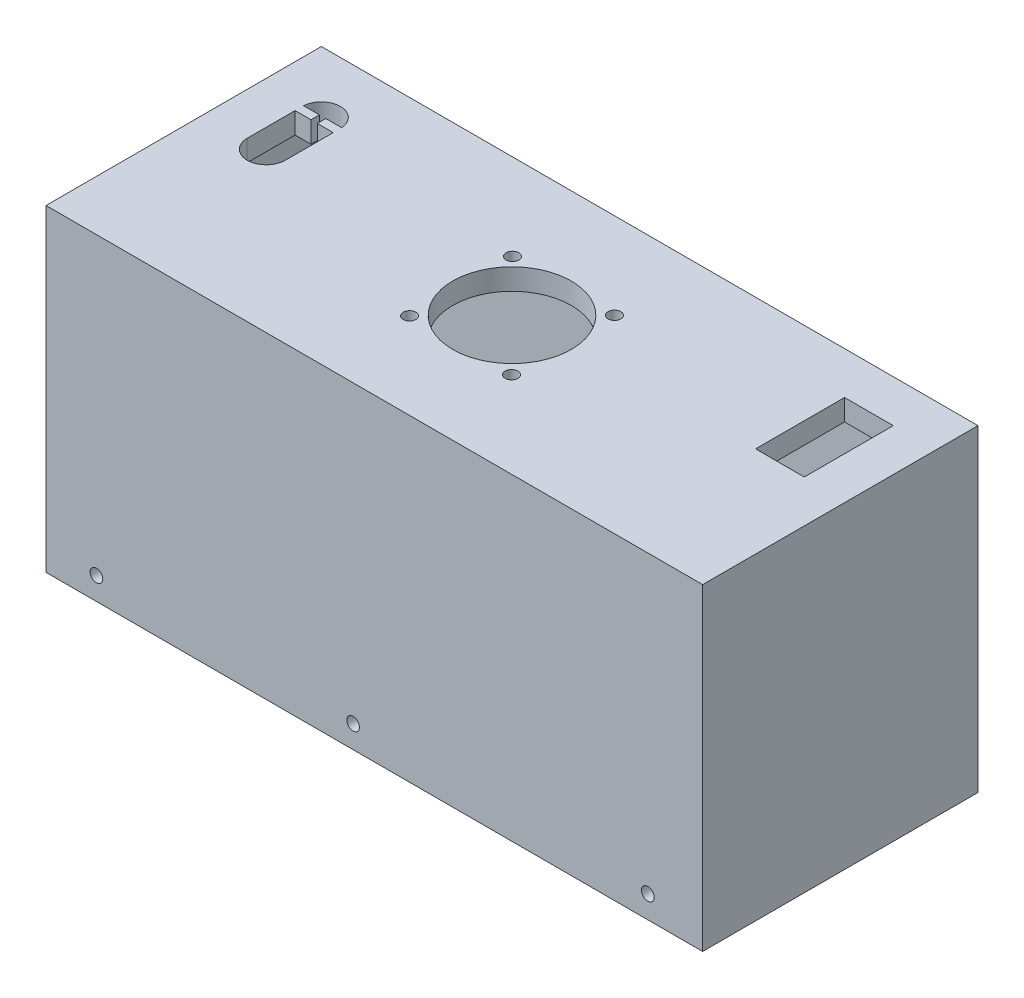
ISO-10303-21;
HEADER;
FILE_DESCRIPTION(('STEP AP214'),'2;1');
FILE_NAME('part.step','',(''),(''),'','','');
FILE_SCHEMA(('AUTOMOTIVE_DESIGN { 1 0 10303 214 1 1 1 1 }'));
ENDSEC;
DATA;
#1=APPLICATION_CONTEXT('core data for automotive mechanical design processes');
#2=APPLICATION_PROTOCOL_DEFINITION('international standard','automotive_design',2000,#1);
#3=PRODUCT_CONTEXT('',#1,'mechanical');
#4=PRODUCT('Part','Part','',(#3));
#5=PRODUCT_RELATED_PRODUCT_CATEGORY('part','',(#4));
#6=PRODUCT_DEFINITION_FORMATION('','',#4);
#7=PRODUCT_DEFINITION_CONTEXT('part definition',#1,'design');
#8=PRODUCT_DEFINITION('design','',#6,#7);
#9=PRODUCT_DEFINITION_SHAPE('','',#8);
#10=(LENGTH_UNIT() NAMED_UNIT(*) SI_UNIT(.MILLI.,.METRE.));
#11=(NAMED_UNIT(*) PLANE_ANGLE_UNIT() SI_UNIT($,.RADIAN.));
#12=(NAMED_UNIT(*) SI_UNIT($,.STERADIAN.) SOLID_ANGLE_UNIT());
#13=UNCERTAINTY_MEASURE_WITH_UNIT(LENGTH_MEASURE(1.E-05),#10,'distance_accuracy_value','');
#14=(GEOMETRIC_REPRESENTATION_CONTEXT(3) GLOBAL_UNCERTAINTY_ASSIGNED_CONTEXT((#13)) GLOBAL_UNIT_ASSIGNED_CONTEXT((#10,
#11,#12)) REPRESENTATION_CONTEXT('',''));
#15=CARTESIAN_POINT('',(0.,0.,0.));
#16=DIRECTION('',(0.,0.,1.));
#17=DIRECTION('',(1.,0.,0.));
#18=AXIS2_PLACEMENT_3D('',#15,#16,#17);
#19=CARTESIAN_POINT('',(0.,75.,0.));
#20=DIRECTION('',(0.,1.,0.));
#21=DIRECTION('',(0.,0.,1.));
#22=AXIS2_PLACEMENT_3D('',#19,#20,#21);
#23=PLANE('',#22);
#24=CARTESIAN_POINT('',(-126.409090909091,75.,7.90909090909085));
#25=DIRECTION('',(0.,1.,0.));
#26=DIRECTION('',(0.,0.,1.));
#27=AXIS2_PLACEMENT_3D('',#24,#25,#26);
#28=CIRCLE('',#27,4.49999999999998);
#29=CARTESIAN_POINT('',(-121.919102044962,75.,7.60909090909087));
#30=VERTEX_POINT('',#29);
#31=CARTESIAN_POINT('',(-130.89907977322,75.,7.60909090909087));
#32=VERTEX_POINT('',#31);
#33=EDGE_CURVE('E290',#30,#32,#28,.T.);
#34=ORIENTED_EDGE('',*,*,#33,.F.);
#35=DIRECTION('',(-1.,0.,0.));
#36=VECTOR('',#35,1.);
#37=CARTESIAN_POINT('',(-121.909090909091,75.,7.60909090909087));
#38=LINE('',#37,#36);
#39=CARTESIAN_POINT('',(-125.659090909091,75.,7.60909090909088));
#40=VERTEX_POINT('',#39);
#41=EDGE_CURVE('E472',#30,#40,#38,.T.);
#42=ORIENTED_EDGE('',*,*,#41,.T.);
#43=DIRECTION('',(0.,0.,1.));
#44=VECTOR('',#43,1.);
#45=CARTESIAN_POINT('',(-125.659090909091,75.,7.60909090909088));
#46=LINE('',#45,#44);
#47=CARTESIAN_POINT('',(-125.659090909091,75.,9.60909090909087));
#48=VERTEX_POINT('',#47);
#49=EDGE_CURVE('E226',#40,#48,#46,.T.);
#50=ORIENTED_EDGE('',*,*,#49,.T.);
#51=DIRECTION('',(1.,0.,0.));
#52=VECTOR('',#51,1.);
#53=CARTESIAN_POINT('',(-121.909090909091,75.,9.60909090909087));
#54=LINE('',#53,#52);
#55=CARTESIAN_POINT('',(-121.909090909091,75.,9.60909090909087));
#56=VERTEX_POINT('',#55);
#57=EDGE_CURVE('E211',#48,#56,#54,.T.);
#58=ORIENTED_EDGE('',*,*,#57,.T.);
#59=DIRECTION('',(0.,0.,1.));
#60=VECTOR('',#59,1.);
#61=CARTESIAN_POINT('',(-121.909090909091,75.,7.90909090909085));
#62=LINE('',#61,#60);
#63=CARTESIAN_POINT('',(-121.909090909091,75.,20.9090909090909));
#64=VERTEX_POINT('',#63);
#65=EDGE_CURVE('E294',#56,#64,#62,.T.);
#66=ORIENTED_EDGE('',*,*,#65,.T.);
#67=CARTESIAN_POINT('',(-126.409090909091,75.,20.9090909090909));
#68=DIRECTION('',(0.,1.,0.));
#69=DIRECTION('',(0.,0.,1.));
#70=AXIS2_PLACEMENT_3D('',#67,#68,#69);
#71=CIRCLE('',#70,4.49999999999998);
#72=CARTESIAN_POINT('',(-130.909090909091,75.,20.9090909090909));
#73=VERTEX_POINT('',#72);
#74=EDGE_CURVE('E296',#73,#64,#71,.T.);
#75=ORIENTED_EDGE('',*,*,#74,.F.);
#76=DIRECTION('',(0.,0.,1.));
#77=VECTOR('',#76,1.);
#78=CARTESIAN_POINT('',(-130.909090909091,75.,7.90909090909085));
#79=LINE('',#78,#77);
#80=CARTESIAN_POINT('',(-130.909090909091,75.,9.60909090909087));
#81=VERTEX_POINT('',#80);
#82=EDGE_CURVE('E299',#81,#73,#79,.T.);
#83=ORIENTED_EDGE('',*,*,#82,.F.);
#84=DIRECTION('',(1.,0.,0.));
#85=VECTOR('',#84,1.);
#86=CARTESIAN_POINT('',(-130.909090909091,75.,9.60909090909087));
#87=LINE('',#86,#85);
#88=CARTESIAN_POINT('',(-127.159090909091,75.,9.60909090909087));
#89=VERTEX_POINT('',#88);
#90=EDGE_CURVE('E238',#81,#89,#87,.T.);
#91=ORIENTED_EDGE('',*,*,#90,.T.);
#92=DIRECTION('',(0.,0.,-1.));
#93=VECTOR('',#92,1.);
#94=CARTESIAN_POINT('',(-127.159090909091,75.,7.60909090909087));
#95=LINE('',#94,#93);
#96=CARTESIAN_POINT('',(-127.159090909091,75.,7.60909090909087));
#97=VERTEX_POINT('',#96);
#98=EDGE_CURVE('E235',#89,#97,#95,.T.);
#99=ORIENTED_EDGE('',*,*,#98,.T.);
#100=DIRECTION('',(-1.,0.,0.));
#101=VECTOR('',#100,1.);
#102=CARTESIAN_POINT('',(-130.909090909091,75.,7.60909090909087));
#103=LINE('',#102,#101);
#104=EDGE_CURVE('E231',#97,#32,#103,.T.);
#105=ORIENTED_EDGE('',*,*,#104,.T.);
#106=EDGE_LOOP('',(#34,#42,#50,#58,#66,#75,#83,#91,#99,#105));
#107=FACE_BOUND('',#106,.T.);
#108=CARTESIAN_POINT('',(-51.3739491511132,75.,13.7600565023752));
#109=DIRECTION('',(0.,-1.,0.));
#110=DIRECTION('',(0.,0.,-1.));
#111=AXIS2_PLACEMENT_3D('',#108,#109,#110);
#112=CIRCLE('',#111,1.5);
#113=CARTESIAN_POINT('',(-51.3739491511132,75.,12.2600565023752));
#114=VERTEX_POINT('',#113);
#115=EDGE_CURVE('E309',#114,#114,#112,.T.);
#116=ORIENTED_EDGE('',*,*,#115,.T.);
#117=EDGE_LOOP('',(#116));
#118=FACE_BOUND('',#117,.T.);
#119=DIRECTION('',(0.,0.,1.));
#120=VECTOR('',#119,1.);
#121=CARTESIAN_POINT('',(-140.909090909091,75.,-6.59090909090913));
#122=LINE('',#121,#120);
#123=CARTESIAN_POINT('',(-140.909090909091,75.,-6.59090909090913));
#124=VERTEX_POINT('',#123);
#125=CARTESIAN_POINT('',(-140.909090909091,75.,58.4090909090909));
#126=VERTEX_POINT('',#125);
#127=EDGE_CURVE('E375',#124,#126,#122,.T.);
#128=ORIENTED_EDGE('',*,*,#127,.T.);
#129=DIRECTION('',(1.,0.,0.));
#130=VECTOR('',#129,1.);
#131=CARTESIAN_POINT('',(-140.909090909091,75.,58.4090909090909));
#132=LINE('',#131,#130);
#133=CARTESIAN_POINT('',(14.0909090909091,75.,58.4090909090909));
#134=VERTEX_POINT('',#133);
#135=EDGE_CURVE('E378',#126,#134,#132,.T.);
#136=ORIENTED_EDGE('',*,*,#135,.T.);
#137=DIRECTION('',(0.,0.,-1.));
#138=VECTOR('',#137,1.);
#139=CARTESIAN_POINT('',(14.0909090909091,75.,-6.59090909090913));
#140=LINE('',#139,#138);
#141=CARTESIAN_POINT('',(14.0909090909091,75.,-6.59090909090913));
#142=VERTEX_POINT('',#141);
#143=EDGE_CURVE('E381',#134,#142,#140,.T.);
#144=ORIENTED_EDGE('',*,*,#143,.T.);
#145=DIRECTION('',(-1.,0.,0.));
#146=VECTOR('',#145,1.);
#147=CARTESIAN_POINT('',(-140.909090909091,75.,-6.59090909090913));
#148=LINE('',#147,#146);
#149=EDGE_CURVE('E383',#142,#124,#148,.T.);
#150=ORIENTED_EDGE('',*,*,#149,.T.);
#151=EDGE_LOOP('',(#128,#136,#144,#150));
#152=FACE_BOUND('',#151,.T.);
#153=CARTESIAN_POINT('',(-75.4442326670686,75.,13.7600565023752));
#154=DIRECTION('',(0.,1.,0.));
#155=DIRECTION('',(0.,0.,1.));
#156=AXIS2_PLACEMENT_3D('',#153,#154,#155);
#157=CIRCLE('',#156,1.5);
#158=CARTESIAN_POINT('',(-75.4442326670686,75.,15.2600565023752));
#159=VERTEX_POINT('',#158);
#160=EDGE_CURVE('E338',#159,#159,#157,.T.);
#161=ORIENTED_EDGE('',*,*,#160,.F.);
#162=EDGE_LOOP('',(#161));
#163=FACE_BOUND('',#162,.T.);
#164=CARTESIAN_POINT('',(-63.4801607308636,75.,25.83734852937));
#165=DIRECTION('',(0.,1.,0.));
#166=DIRECTION('',(0.,0.,1.));
#167=AXIS2_PLACEMENT_3D('',#164,#165,#166);
#168=CIRCLE('',#167,14.);
#169=CARTESIAN_POINT('',(-63.4801607308636,75.,39.83734852937));
#170=VERTEX_POINT('',#169);
#171=EDGE_CURVE('E334',#170,#170,#168,.T.);
#172=ORIENTED_EDGE('',*,*,#171,.F.);
#173=EDGE_LOOP('',(#172));
#174=FACE_BOUND('',#173,.T.);
#175=DIRECTION('',(1.,0.,0.));
#176=VECTOR('',#175,1.);
#177=CARTESIAN_POINT('',(0.,75.,3.40909090909087));
#178=LINE('',#177,#176);
#179=CARTESIAN_POINT('',(-7.40909090909091,75.,3.40909090909087));
#180=VERTEX_POINT('',#179);
#181=CARTESIAN_POINT('',(4.09090909090909,75.,3.40909090909087));
#182=VERTEX_POINT('',#181);
#183=EDGE_CURVE('E328',#180,#182,#178,.T.);
#184=ORIENTED_EDGE('',*,*,#183,.T.);
#185=DIRECTION('',(0.,0.,1.));
#186=VECTOR('',#185,1.);
#187=CARTESIAN_POINT('',(4.09090909090909,75.,0.));
#188=LINE('',#187,#186);
#189=CARTESIAN_POINT('',(4.0909090909091,75.,24.4090909090909));
#190=VERTEX_POINT('',#189);
#191=EDGE_CURVE('E331',#182,#190,#188,.T.);
#192=ORIENTED_EDGE('',*,*,#191,.T.);
#193=DIRECTION('',(1.,0.,0.));
#194=VECTOR('',#193,1.);
#195=CARTESIAN_POINT('',(0.,75.,24.4090909090909));
#196=LINE('',#195,#194);
#197=CARTESIAN_POINT('',(-7.4090909090909,75.,24.4090909090909));
#198=VERTEX_POINT('',#197);
#199=EDGE_CURVE('E316',#198,#190,#196,.T.);
#200=ORIENTED_EDGE('',*,*,#199,.F.);
#201=DIRECTION('',(0.,0.,1.));
#202=VECTOR('',#201,1.);
#203=CARTESIAN_POINT('',(-7.40909090909091,75.,0.));
#204=LINE('',#203,#202);
#205=EDGE_CURVE('E325',#180,#198,#204,.T.);
#206=ORIENTED_EDGE('',*,*,#205,.F.);
#207=EDGE_LOOP('',(#184,#192,#200,#206));
#208=FACE_BOUND('',#207,.T.);
#209=CARTESIAN_POINT('',(-51.3739491511132,75.,38.0581253158066));
#210=DIRECTION('',(0.,1.,0.));
#211=DIRECTION('',(0.,0.,1.));
#212=AXIS2_PLACEMENT_3D('',#209,#210,#211);
#213=CIRCLE('',#212,1.5);
#214=CARTESIAN_POINT('',(-51.3739491511132,75.,39.5581253158066));
#215=VERTEX_POINT('',#214);
#216=EDGE_CURVE('E305',#215,#215,#213,.T.);
#217=ORIENTED_EDGE('',*,*,#216,.F.);
#218=EDGE_LOOP('',(#217));
#219=FACE_BOUND('',#218,.T.);
#220=CARTESIAN_POINT('',(-75.4442326670686,75.,38.0581253158066));
#221=DIRECTION('',(0.,-1.,0.));
#222=DIRECTION('',(0.,0.,-1.));
#223=AXIS2_PLACEMENT_3D('',#220,#221,#222);
#224=CIRCLE('',#223,1.5);
#225=CARTESIAN_POINT('',(-75.4442326670686,75.,36.5581253158066));
#226=VERTEX_POINT('',#225);
#227=EDGE_CURVE('E301',#226,#226,#224,.T.);
#228=ORIENTED_EDGE('',*,*,#227,.T.);
#229=EDGE_LOOP('',(#228));
#230=FACE_BOUND('',#229,.T.);
#231=ADVANCED_FACE('F57',(#107,#118,#152,#163,#174,#208,#219,#230),#23,.T.);
#232=CARTESIAN_POINT('',(0.,70.,0.));
#233=DIRECTION('',(0.,-1.,0.));
#234=DIRECTION('',(0.,0.,-1.));
#235=AXIS2_PLACEMENT_3D('',#232,#233,#234);
#236=PLANE('',#235);
#237=DIRECTION('',(-1.,0.,0.));
#238=VECTOR('',#237,1.);
#239=CARTESIAN_POINT('',(-121.909090909091,70.,7.60909090909087));
#240=LINE('',#239,#238);
#241=CARTESIAN_POINT('',(-121.919102044962,70.,7.60909090909087));
#242=VERTEX_POINT('',#241);
#243=CARTESIAN_POINT('',(-125.659090909091,70.,7.60909090909088));
#244=VERTEX_POINT('',#243);
#245=EDGE_CURVE('E203',#242,#244,#240,.T.);
#246=ORIENTED_EDGE('',*,*,#245,.F.);
#247=CARTESIAN_POINT('',(-126.409090909091,70.,7.90909090909085));
#248=DIRECTION('',(0.,-1.,0.));
#249=DIRECTION('',(0.,0.,-1.));
#250=AXIS2_PLACEMENT_3D('',#247,#248,#249);
#251=CIRCLE('',#250,4.49999999999998);
#252=CARTESIAN_POINT('',(-130.89907977322,70.,7.60909090909087));
#253=VERTEX_POINT('',#252);
#254=EDGE_CURVE('E71',#253,#242,#251,.T.);
#255=ORIENTED_EDGE('',*,*,#254,.F.);
#256=DIRECTION('',(-1.,0.,0.));
#257=VECTOR('',#256,1.);
#258=CARTESIAN_POINT('',(-130.909090909091,70.,7.60909090909087));
#259=LINE('',#258,#257);
#260=CARTESIAN_POINT('',(-127.159090909091,70.,7.60909090909087));
#261=VERTEX_POINT('',#260);
#262=EDGE_CURVE('E245',#261,#253,#259,.T.);
#263=ORIENTED_EDGE('',*,*,#262,.F.);
#264=DIRECTION('',(0.,0.,-1.));
#265=VECTOR('',#264,1.);
#266=CARTESIAN_POINT('',(-127.159090909091,70.,7.60909090909087));
#267=LINE('',#266,#265);
#268=CARTESIAN_POINT('',(-127.159090909091,70.,9.60909090909087));
#269=VERTEX_POINT('',#268);
#270=EDGE_CURVE('E249',#269,#261,#267,.T.);
#271=ORIENTED_EDGE('',*,*,#270,.F.);
#272=DIRECTION('',(1.,0.,0.));
#273=VECTOR('',#272,1.);
#274=CARTESIAN_POINT('',(-130.909090909091,70.,9.60909090909087));
#275=LINE('',#274,#273);
#276=CARTESIAN_POINT('',(-130.909090909091,70.,9.60909090909087));
#277=VERTEX_POINT('',#276);
#278=EDGE_CURVE('E234',#277,#269,#275,.T.);
#279=ORIENTED_EDGE('',*,*,#278,.F.);
#280=DIRECTION('',(0.,0.,-1.));
#281=VECTOR('',#280,1.);
#282=CARTESIAN_POINT('',(-130.909090909091,70.,0.));
#283=LINE('',#282,#281);
#284=CARTESIAN_POINT('',(-130.909090909091,70.,20.9090909090909));
#285=VERTEX_POINT('',#284);
#286=EDGE_CURVE('E430',#285,#277,#283,.T.);
#287=ORIENTED_EDGE('',*,*,#286,.F.);
#288=CARTESIAN_POINT('',(-126.409090909091,70.,20.9090909090909));
#289=DIRECTION('',(0.,-1.,0.));
#290=DIRECTION('',(0.,0.,-1.));
#291=AXIS2_PLACEMENT_3D('',#288,#289,#290);
#292=CIRCLE('',#291,4.49999999999998);
#293=CARTESIAN_POINT('',(-121.909090909091,70.,20.9090909090909));
#294=VERTEX_POINT('',#293);
#295=EDGE_CURVE('E419',#294,#285,#292,.T.);
#296=ORIENTED_EDGE('',*,*,#295,.F.);
#297=DIRECTION('',(0.,0.,-1.));
#298=VECTOR('',#297,1.);
#299=CARTESIAN_POINT('',(-121.909090909091,70.,1.30140653498455E-13));
#300=LINE('',#299,#298);
#301=CARTESIAN_POINT('',(-121.909090909091,70.,9.60909090909087));
#302=VERTEX_POINT('',#301);
#303=EDGE_CURVE('E427',#294,#302,#300,.T.);
#304=ORIENTED_EDGE('',*,*,#303,.T.);
#305=DIRECTION('',(1.,0.,0.));
#306=VECTOR('',#305,1.);
#307=CARTESIAN_POINT('',(-121.909090909091,70.,9.60909090909087));
#308=LINE('',#307,#306);
#309=CARTESIAN_POINT('',(-125.659090909091,70.,9.60909090909087));
#310=VERTEX_POINT('',#309);
#311=EDGE_CURVE('E219',#310,#302,#308,.T.);
#312=ORIENTED_EDGE('',*,*,#311,.F.);
#313=DIRECTION('',(0.,0.,1.));
#314=VECTOR('',#313,1.);
#315=CARTESIAN_POINT('',(-125.659090909091,70.,7.60909090909088));
#316=LINE('',#315,#314);
#317=EDGE_CURVE('E214',#244,#310,#316,.T.);
#318=ORIENTED_EDGE('',*,*,#317,.F.);
#319=EDGE_LOOP('',(#246,#255,#263,#271,#279,#287,#296,#304,#312,#318));
#320=FACE_BOUND('',#319,.T.);
#321=CARTESIAN_POINT('',(-51.3739491511132,70.,13.7600565023752));
#322=DIRECTION('',(0.,-1.,0.));
#323=DIRECTION('',(0.,0.,-1.));
#324=AXIS2_PLACEMENT_3D('',#321,#322,#323);
#325=CIRCLE('',#324,1.5);
#326=CARTESIAN_POINT('',(-51.3739491511132,70.,12.2600565023752));
#327=VERTEX_POINT('',#326);
#328=EDGE_CURVE('E312',#327,#327,#325,.F.);
#329=ORIENTED_EDGE('',*,*,#328,.T.);
#330=EDGE_LOOP('',(#329));
#331=FACE_BOUND('',#330,.T.);
#332=DIRECTION('',(0.,0.,-1.));
#333=VECTOR('',#332,1.);
#334=CARTESIAN_POINT('',(-135.909090909091,70.,53.4090909090909));
#335=LINE('',#334,#333);
#336=CARTESIAN_POINT('',(-135.909090909091,70.,53.4090909090909));
#337=VERTEX_POINT('',#336);
#338=CARTESIAN_POINT('',(-135.909090909091,70.,-1.59090909090913));
#339=VERTEX_POINT('',#338);
#340=EDGE_CURVE('E342',#337,#339,#335,.T.);
#341=ORIENTED_EDGE('',*,*,#340,.T.);
#342=DIRECTION('',(1.,0.,0.));
#343=VECTOR('',#342,1.);
#344=CARTESIAN_POINT('',(-135.909090909091,70.,-1.59090909090913));
#345=LINE('',#344,#343);
#346=CARTESIAN_POINT('',(9.09090909090909,70.,-1.59090909090913));
#347=VERTEX_POINT('',#346);
#348=EDGE_CURVE('E345',#339,#347,#345,.T.);
#349=ORIENTED_EDGE('',*,*,#348,.T.);
#350=DIRECTION('',(0.,0.,1.));
#351=VECTOR('',#350,1.);
#352=CARTESIAN_POINT('',(9.09090909090909,70.,53.4090909090909));
#353=LINE('',#352,#351);
#354=CARTESIAN_POINT('',(9.09090909090909,70.,53.4090909090909));
#355=VERTEX_POINT('',#354);
#356=EDGE_CURVE('E349',#347,#355,#353,.T.);
#357=ORIENTED_EDGE('',*,*,#356,.T.);
#358=DIRECTION('',(-1.,0.,0.));
#359=VECTOR('',#358,1.);
#360=CARTESIAN_POINT('',(-135.909090909091,70.,53.4090909090909));
#361=LINE('',#360,#359);
#362=EDGE_CURVE('E352',#355,#337,#361,.T.);
#363=ORIENTED_EDGE('',*,*,#362,.T.);
#364=EDGE_LOOP('',(#341,#349,#357,#363));
#365=FACE_BOUND('',#364,.T.);
#366=CARTESIAN_POINT('',(-75.4442326670686,70.,13.7600565023752));
#367=DIRECTION('',(0.,-1.,0.));
#368=DIRECTION('',(0.,0.,-1.));
#369=AXIS2_PLACEMENT_3D('',#366,#367,#368);
#370=CIRCLE('',#369,1.5);
#371=CARTESIAN_POINT('',(-75.4442326670686,70.,12.2600565023752));
#372=VERTEX_POINT('',#371);
#373=EDGE_CURVE('E341',#372,#372,#370,.T.);
#374=ORIENTED_EDGE('',*,*,#373,.F.);
#375=EDGE_LOOP('',(#374));
#376=FACE_BOUND('',#375,.T.);
#377=CARTESIAN_POINT('',(-63.4801607308636,70.,25.83734852937));
#378=DIRECTION('',(0.,-1.,0.));
#379=DIRECTION('',(0.,0.,-1.));
#380=AXIS2_PLACEMENT_3D('',#377,#378,#379);
#381=CIRCLE('',#380,14.);
#382=CARTESIAN_POINT('',(-63.4801607308636,70.,11.83734852937));
#383=VERTEX_POINT('',#382);
#384=EDGE_CURVE('E337',#383,#383,#381,.T.);
#385=ORIENTED_EDGE('',*,*,#384,.F.);
#386=EDGE_LOOP('',(#385));
#387=FACE_BOUND('',#386,.T.);
#388=DIRECTION('',(-1.,0.,0.));
#389=VECTOR('',#388,1.);
#390=CARTESIAN_POINT('',(0.,70.,24.4090909090909));
#391=LINE('',#390,#389);
#392=CARTESIAN_POINT('',(4.0909090909091,70.,24.4090909090909));
#393=VERTEX_POINT('',#392);
#394=CARTESIAN_POINT('',(-7.4090909090909,70.,24.4090909090909));
#395=VERTEX_POINT('',#394);
#396=EDGE_CURVE('E414',#393,#395,#391,.T.);
#397=ORIENTED_EDGE('',*,*,#396,.F.);
#398=DIRECTION('',(0.,0.,-1.));
#399=VECTOR('',#398,1.);
#400=CARTESIAN_POINT('',(4.09090909090909,70.,0.));
#401=LINE('',#400,#399);
#402=CARTESIAN_POINT('',(4.09090909090909,70.,3.40909090909087));
#403=VERTEX_POINT('',#402);
#404=EDGE_CURVE('E416',#393,#403,#401,.T.);
#405=ORIENTED_EDGE('',*,*,#404,.T.);
#406=DIRECTION('',(-1.,0.,0.));
#407=VECTOR('',#406,1.);
#408=CARTESIAN_POINT('',(0.,70.,3.40909090909087));
#409=LINE('',#408,#407);
#410=CARTESIAN_POINT('',(-7.40909090909091,70.,3.40909090909087));
#411=VERTEX_POINT('',#410);
#412=EDGE_CURVE('E404',#403,#411,#409,.T.);
#413=ORIENTED_EDGE('',*,*,#412,.T.);
#414=DIRECTION('',(0.,0.,-1.));
#415=VECTOR('',#414,1.);
#416=CARTESIAN_POINT('',(-7.40909090909091,70.,0.));
#417=LINE('',#416,#415);
#418=EDGE_CURVE('E411',#395,#411,#417,.T.);
#419=ORIENTED_EDGE('',*,*,#418,.F.);
#420=EDGE_LOOP('',(#397,#405,#413,#419));
#421=FACE_BOUND('',#420,.T.);
#422=CARTESIAN_POINT('',(-51.3739491511132,70.,38.0581253158066));
#423=DIRECTION('',(0.,-1.,0.));
#424=DIRECTION('',(0.,0.,-1.));
#425=AXIS2_PLACEMENT_3D('',#422,#423,#424);
#426=CIRCLE('',#425,1.5);
#427=CARTESIAN_POINT('',(-51.3739491511132,70.,36.5581253158066));
#428=VERTEX_POINT('',#427);
#429=EDGE_CURVE('E308',#428,#428,#426,.T.);
#430=ORIENTED_EDGE('',*,*,#429,.F.);
#431=EDGE_LOOP('',(#430));
#432=FACE_BOUND('',#431,.T.);
#433=CARTESIAN_POINT('',(-75.4442326670686,70.,38.0581253158066));
#434=DIRECTION('',(0.,-1.,0.));
#435=DIRECTION('',(0.,0.,-1.));
#436=AXIS2_PLACEMENT_3D('',#433,#434,#435);
#437=CIRCLE('',#436,1.5);
#438=CARTESIAN_POINT('',(-75.4442326670686,70.,36.5581253158066));
#439=VERTEX_POINT('',#438);
#440=EDGE_CURVE('E304',#439,#439,#437,.F.);
#441=ORIENTED_EDGE('',*,*,#440,.T.);
#442=EDGE_LOOP('',(#441));
#443=FACE_BOUND('',#442,.T.);
#444=ADVANCED_FACE('F215',(#320,#331,#365,#376,#387,#421,#432,#443),#236,.T.);
#445=CARTESIAN_POINT('',(-140.909090909091,75.,-6.59090909090913));
#446=DIRECTION('',(1.,0.,0.));
#447=DIRECTION('',(0.,0.,-1.));
#448=AXIS2_PLACEMENT_3D('',#445,#446,#447);
#449=PLANE('',#448);
#450=DIRECTION('',(0.,0.,1.));
#451=VECTOR('',#450,1.);
#452=CARTESIAN_POINT('',(-140.909090909091,0.,-6.59090909090913));
#453=LINE('',#452,#451);
#454=CARTESIAN_POINT('',(-140.909090909091,0.,-6.59090909090913));
#455=VERTEX_POINT('',#454);
#456=CARTESIAN_POINT('',(-140.909090909091,0.,58.4090909090909));
#457=VERTEX_POINT('',#456);
#458=EDGE_CURVE('E368',#455,#457,#453,.T.);
#459=ORIENTED_EDGE('',*,*,#458,.T.);
#460=DIRECTION('',(0.,-1.,0.));
#461=VECTOR('',#460,1.);
#462=CARTESIAN_POINT('',(-140.909090909091,75.,58.4090909090909));
#463=LINE('',#462,#461);
#464=EDGE_CURVE('E401',#126,#457,#463,.T.);
#465=ORIENTED_EDGE('',*,*,#464,.F.);
#466=ORIENTED_EDGE('',*,*,#127,.F.);
#467=DIRECTION('',(0.,-1.,0.));
#468=VECTOR('',#467,1.);
#469=CARTESIAN_POINT('',(-140.909090909091,75.,-6.59090909090913));
#470=LINE('',#469,#468);
#471=EDGE_CURVE('E385',#124,#455,#470,.T.);
#472=ORIENTED_EDGE('',*,*,#471,.T.);
#473=EDGE_LOOP('',(#459,#465,#466,#472));
#474=FACE_BOUND('',#473,.T.);
#475=ADVANCED_FACE('F59',(#474),#449,.F.);
#476=CARTESIAN_POINT('',(-140.909090909091,75.,58.4090909090909));
#477=DIRECTION('',(0.,0.,-1.));
#478=DIRECTION('',(-1.,0.,0.));
#479=AXIS2_PLACEMENT_3D('',#476,#477,#478);
#480=PLANE('',#479);
#481=CARTESIAN_POINT('',(-129.008167682105,5.31203336839354,58.4090909090909));
#482=DIRECTION('',(0.,0.,1.));
#483=DIRECTION('',(1.,0.,0.));
#484=AXIS2_PLACEMENT_3D('',#481,#482,#483);
#485=CIRCLE('',#484,1.49999999999997);
#486=CARTESIAN_POINT('',(-127.508167682105,5.31203336839354,58.4090909090909));
#487=VERTEX_POINT('',#486);
#488=EDGE_CURVE('E256',#487,#487,#485,.T.);
#489=ORIENTED_EDGE('',*,*,#488,.F.);
#490=EDGE_LOOP('',(#489));
#491=FACE_BOUND('',#490,.T.);
#492=CARTESIAN_POINT('',(1.15635705759814,5.32390647711567,58.4090909090909));
#493=DIRECTION('',(0.,0.,1.));
#494=DIRECTION('',(1.,0.,0.));
#495=AXIS2_PLACEMENT_3D('',#492,#493,#494);
#496=CIRCLE('',#495,1.5);
#497=CARTESIAN_POINT('',(2.65635705759814,5.32390647711567,58.4090909090909));
#498=VERTEX_POINT('',#497);
#499=EDGE_CURVE('E266',#498,#498,#496,.T.);
#500=ORIENTED_EDGE('',*,*,#499,.F.);
#501=EDGE_LOOP('',(#500));
#502=FACE_BOUND('',#501,.T.);
#503=CARTESIAN_POINT('',(-68.4120523997798,5.31203336839354,58.4090909090909));
#504=DIRECTION('',(0.,0.,1.));
#505=DIRECTION('',(1.,0.,0.));
#506=AXIS2_PLACEMENT_3D('',#503,#504,#505);
#507=CIRCLE('',#506,1.5);
#508=CARTESIAN_POINT('',(-66.9120523997798,5.31203336839354,58.4090909090909));
#509=VERTEX_POINT('',#508);
#510=EDGE_CURVE('E276',#509,#509,#507,.T.);
#511=ORIENTED_EDGE('',*,*,#510,.F.);
#512=EDGE_LOOP('',(#511));
#513=FACE_BOUND('',#512,.T.);
#514=DIRECTION('',(1.,0.,0.));
#515=VECTOR('',#514,1.);
#516=CARTESIAN_POINT('',(-140.909090909091,0.,58.4090909090909));
#517=LINE('',#516,#515);
#518=CARTESIAN_POINT('',(14.0909090909091,0.,58.4090909090909));
#519=VERTEX_POINT('',#518);
#520=EDGE_CURVE('E388',#457,#519,#517,.T.);
#521=ORIENTED_EDGE('',*,*,#520,.T.);
#522=DIRECTION('',(0.,-1.,0.));
#523=VECTOR('',#522,1.);
#524=CARTESIAN_POINT('',(14.0909090909091,75.,58.4090909090909));
#525=LINE('',#524,#523);
#526=EDGE_CURVE('E398',#134,#519,#525,.T.);
#527=ORIENTED_EDGE('',*,*,#526,.F.);
#528=ORIENTED_EDGE('',*,*,#135,.F.);
#529=ORIENTED_EDGE('',*,*,#464,.T.);
#530=EDGE_LOOP('',(#521,#527,#528,#529));
#531=FACE_BOUND('',#530,.T.);
#532=ADVANCED_FACE('F501',(#491,#502,#513,#531),#480,.F.);
#533=CARTESIAN_POINT('',(14.0909090909091,75.,-6.59090909090913));
#534=DIRECTION('',(-1.,0.,0.));
#535=DIRECTION('',(0.,0.,1.));
#536=AXIS2_PLACEMENT_3D('',#533,#534,#535);
#537=PLANE('',#536);
#538=DIRECTION('',(0.,0.,-1.));
#539=VECTOR('',#538,1.);
#540=CARTESIAN_POINT('',(14.0909090909091,0.,-6.59090909090913));
#541=LINE('',#540,#539);
#542=CARTESIAN_POINT('',(14.0909090909091,0.,-6.59090909090913));
#543=VERTEX_POINT('',#542);
#544=EDGE_CURVE('E390',#519,#543,#541,.T.);
#545=ORIENTED_EDGE('',*,*,#544,.T.);
#546=DIRECTION('',(0.,-1.,0.));
#547=VECTOR('',#546,1.);
#548=CARTESIAN_POINT('',(14.0909090909091,75.,-6.59090909090913));
#549=LINE('',#548,#547);
#550=EDGE_CURVE('E395',#142,#543,#549,.T.);
#551=ORIENTED_EDGE('',*,*,#550,.F.);
#552=ORIENTED_EDGE('',*,*,#143,.F.);
#553=ORIENTED_EDGE('',*,*,#526,.T.);
#554=EDGE_LOOP('',(#545,#551,#552,#553));
#555=FACE_BOUND('',#554,.T.);
#556=ADVANCED_FACE('F498',(#555),#537,.F.);
#557=CARTESIAN_POINT('',(-140.909090909091,75.,-6.59090909090913));
#558=DIRECTION('',(0.,0.,1.));
#559=DIRECTION('',(1.,0.,0.));
#560=AXIS2_PLACEMENT_3D('',#557,#558,#559);
#561=PLANE('',#560);
#562=CARTESIAN_POINT('',(-129.008167682105,5.31203336839354,-6.59090909090913));
#563=DIRECTION('',(0.,0.,1.));
#564=DIRECTION('',(1.,0.,0.));
#565=AXIS2_PLACEMENT_3D('',#562,#563,#564);
#566=CIRCLE('',#565,1.49999999999997);
#567=CARTESIAN_POINT('',(-127.508167682105,5.31203336839354,-6.59090909090913));
#568=VERTEX_POINT('',#567);
#569=EDGE_CURVE('E263',#568,#568,#566,.T.);
#570=ORIENTED_EDGE('',*,*,#569,.T.);
#571=EDGE_LOOP('',(#570));
#572=FACE_BOUND('',#571,.T.);
#573=CARTESIAN_POINT('',(1.15635705759814,5.32390647711567,-6.59090909090913));
#574=DIRECTION('',(0.,0.,1.));
#575=DIRECTION('',(1.,0.,0.));
#576=AXIS2_PLACEMENT_3D('',#573,#574,#575);
#577=CIRCLE('',#576,1.5);
#578=CARTESIAN_POINT('',(2.65635705759814,5.32390647711567,-6.59090909090913));
#579=VERTEX_POINT('',#578);
#580=EDGE_CURVE('E273',#579,#579,#577,.T.);
#581=ORIENTED_EDGE('',*,*,#580,.T.);
#582=EDGE_LOOP('',(#581));
#583=FACE_BOUND('',#582,.T.);
#584=CARTESIAN_POINT('',(-68.4120523997798,5.31203336839354,-6.59090909090913));
#585=DIRECTION('',(0.,0.,1.));
#586=DIRECTION('',(1.,0.,0.));
#587=AXIS2_PLACEMENT_3D('',#584,#585,#586);
#588=CIRCLE('',#587,1.5);
#589=CARTESIAN_POINT('',(-66.9120523997798,5.31203336839354,-6.59090909090913));
#590=VERTEX_POINT('',#589);
#591=EDGE_CURVE('E283',#590,#590,#588,.T.);
#592=ORIENTED_EDGE('',*,*,#591,.T.);
#593=EDGE_LOOP('',(#592));
#594=FACE_BOUND('',#593,.T.);
#595=DIRECTION('',(-1.,0.,0.));
#596=VECTOR('',#595,1.);
#597=CARTESIAN_POINT('',(-140.909090909091,0.,-6.59090909090913));
#598=LINE('',#597,#596);
#599=EDGE_CURVE('E379',#543,#455,#598,.T.);
#600=ORIENTED_EDGE('',*,*,#599,.T.);
#601=ORIENTED_EDGE('',*,*,#471,.F.);
#602=ORIENTED_EDGE('',*,*,#149,.F.);
#603=ORIENTED_EDGE('',*,*,#550,.T.);
#604=EDGE_LOOP('',(#600,#601,#602,#603));
#605=FACE_BOUND('',#604,.T.);
#606=ADVANCED_FACE('F494',(#572,#583,#594,#605),#561,.F.);
#607=CARTESIAN_POINT('',(0.,0.,0.));
#608=DIRECTION('',(0.,1.,0.));
#609=DIRECTION('',(0.,0.,1.));
#610=AXIS2_PLACEMENT_3D('',#607,#608,#609);
#611=PLANE('',#610);
#612=DIRECTION('',(1.,0.,0.));
#613=VECTOR('',#612,1.);
#614=CARTESIAN_POINT('',(-135.909090909091,0.,-1.59090909090913));
#615=LINE('',#614,#613);
#616=CARTESIAN_POINT('',(-135.909090909091,0.,-1.59090909090913));
#617=VERTEX_POINT('',#616);
#618=CARTESIAN_POINT('',(9.09090909090909,0.,-1.59090909090913));
#619=VERTEX_POINT('',#618);
#620=EDGE_CURVE('E358',#617,#619,#615,.T.);
#621=ORIENTED_EDGE('',*,*,#620,.F.);
#622=DIRECTION('',(0.,0.,-1.));
#623=VECTOR('',#622,1.);
#624=CARTESIAN_POINT('',(-135.909090909091,0.,53.4090909090909));
#625=LINE('',#624,#623);
#626=CARTESIAN_POINT('',(-135.909090909091,0.,53.4090909090909));
#627=VERTEX_POINT('',#626);
#628=EDGE_CURVE('E356',#627,#617,#625,.T.);
#629=ORIENTED_EDGE('',*,*,#628,.F.);
#630=DIRECTION('',(-1.,0.,0.));
#631=VECTOR('',#630,1.);
#632=CARTESIAN_POINT('',(-135.909090909091,0.,53.4090909090909));
#633=LINE('',#632,#631);
#634=CARTESIAN_POINT('',(9.09090909090909,0.,53.4090909090909));
#635=VERTEX_POINT('',#634);
#636=EDGE_CURVE('E346',#635,#627,#633,.T.);
#637=ORIENTED_EDGE('',*,*,#636,.F.);
#638=DIRECTION('',(0.,0.,1.));
#639=VECTOR('',#638,1.);
#640=CARTESIAN_POINT('',(9.09090909090909,0.,53.4090909090909));
#641=LINE('',#640,#639);
#642=EDGE_CURVE('E361',#619,#635,#641,.T.);
#643=ORIENTED_EDGE('',*,*,#642,.F.);
#644=EDGE_LOOP('',(#621,#629,#637,#643));
#645=FACE_BOUND('',#644,.T.);
#646=ORIENTED_EDGE('',*,*,#458,.F.);
#647=ORIENTED_EDGE('',*,*,#599,.F.);
#648=ORIENTED_EDGE('',*,*,#544,.F.);
#649=ORIENTED_EDGE('',*,*,#520,.F.);
#650=EDGE_LOOP('',(#646,#647,#648,#649));
#651=FACE_BOUND('',#650,.T.);
#652=ADVANCED_FACE('F491',(#645,#651),#611,.F.);
#653=CARTESIAN_POINT('',(-135.909090909091,70.,53.4090909090909));
#654=DIRECTION('',(-1.,0.,0.));
#655=DIRECTION('',(0.,0.,1.));
#656=AXIS2_PLACEMENT_3D('',#653,#654,#655);
#657=PLANE('',#656);
#658=ORIENTED_EDGE('',*,*,#628,.T.);
#659=DIRECTION('',(0.,-1.,0.));
#660=VECTOR('',#659,1.);
#661=CARTESIAN_POINT('',(-135.909090909091,70.,-1.59090909090913));
#662=LINE('',#661,#660);
#663=EDGE_CURVE('E355',#339,#617,#662,.T.);
#664=ORIENTED_EDGE('',*,*,#663,.F.);
#665=ORIENTED_EDGE('',*,*,#340,.F.);
#666=DIRECTION('',(0.,-1.,0.));
#667=VECTOR('',#666,1.);
#668=CARTESIAN_POINT('',(-135.909090909091,70.,53.4090909090909));
#669=LINE('',#668,#667);
#670=EDGE_CURVE('E366',#337,#627,#669,.T.);
#671=ORIENTED_EDGE('',*,*,#670,.T.);
#672=EDGE_LOOP('',(#658,#664,#665,#671));
#673=FACE_BOUND('',#672,.T.);
#674=ADVANCED_FACE('F489',(#673),#657,.F.);
#675=CARTESIAN_POINT('',(-135.909090909091,70.,53.4090909090909));
#676=DIRECTION('',(0.,0.,1.));
#677=DIRECTION('',(1.,0.,0.));
#678=AXIS2_PLACEMENT_3D('',#675,#676,#677);
#679=PLANE('',#678);
#680=CARTESIAN_POINT('',(-129.008167682105,5.31203336839354,53.4090909090909));
#681=DIRECTION('',(0.,0.,1.));
#682=DIRECTION('',(1.,0.,0.));
#683=AXIS2_PLACEMENT_3D('',#680,#681,#682);
#684=CIRCLE('',#683,1.49999999999997);
#685=CARTESIAN_POINT('',(-127.508167682105,5.31203336839354,53.4090909090909));
#686=VERTEX_POINT('',#685);
#687=EDGE_CURVE('E260',#686,#686,#684,.T.);
#688=ORIENTED_EDGE('',*,*,#687,.T.);
#689=EDGE_LOOP('',(#688));
#690=FACE_BOUND('',#689,.T.);
#691=CARTESIAN_POINT('',(1.15635705759814,5.32390647711567,53.4090909090909));
#692=DIRECTION('',(0.,0.,1.));
#693=DIRECTION('',(1.,0.,0.));
#694=AXIS2_PLACEMENT_3D('',#691,#692,#693);
#695=CIRCLE('',#694,1.5);
#696=CARTESIAN_POINT('',(2.65635705759814,5.32390647711567,53.4090909090909));
#697=VERTEX_POINT('',#696);
#698=EDGE_CURVE('E270',#697,#697,#695,.T.);
#699=ORIENTED_EDGE('',*,*,#698,.T.);
#700=EDGE_LOOP('',(#699));
#701=FACE_BOUND('',#700,.T.);
#702=CARTESIAN_POINT('',(-68.4120523997798,5.31203336839354,53.4090909090909));
#703=DIRECTION('',(0.,0.,1.));
#704=DIRECTION('',(1.,0.,0.));
#705=AXIS2_PLACEMENT_3D('',#702,#703,#704);
#706=CIRCLE('',#705,1.5);
#707=CARTESIAN_POINT('',(-66.9120523997798,5.31203336839354,53.4090909090909));
#708=VERTEX_POINT('',#707);
#709=EDGE_CURVE('E280',#708,#708,#706,.T.);
#710=ORIENTED_EDGE('',*,*,#709,.T.);
#711=EDGE_LOOP('',(#710));
#712=FACE_BOUND('',#711,.T.);
#713=ORIENTED_EDGE('',*,*,#636,.T.);
#714=ORIENTED_EDGE('',*,*,#670,.F.);
#715=ORIENTED_EDGE('',*,*,#362,.F.);
#716=DIRECTION('',(0.,-1.,0.));
#717=VECTOR('',#716,1.);
#718=CARTESIAN_POINT('',(9.09090909090909,70.,53.4090909090909));
#719=LINE('',#718,#717);
#720=EDGE_CURVE('E369',#355,#635,#719,.T.);
#721=ORIENTED_EDGE('',*,*,#720,.T.);
#722=EDGE_LOOP('',(#713,#714,#715,#721));
#723=FACE_BOUND('',#722,.T.);
#724=ADVANCED_FACE('F585',(#690,#701,#712,#723),#679,.F.);
#725=CARTESIAN_POINT('',(9.09090909090909,70.,53.4090909090909));
#726=DIRECTION('',(1.,0.,0.));
#727=DIRECTION('',(0.,0.,-1.));
#728=AXIS2_PLACEMENT_3D('',#725,#726,#727);
#729=PLANE('',#728);
#730=ORIENTED_EDGE('',*,*,#642,.T.);
#731=ORIENTED_EDGE('',*,*,#720,.F.);
#732=ORIENTED_EDGE('',*,*,#356,.F.);
#733=DIRECTION('',(0.,-1.,0.));
#734=VECTOR('',#733,1.);
#735=CARTESIAN_POINT('',(9.09090909090909,70.,-1.59090909090913));
#736=LINE('',#735,#734);
#737=EDGE_CURVE('E371',#347,#619,#736,.T.);
#738=ORIENTED_EDGE('',*,*,#737,.T.);
#739=EDGE_LOOP('',(#730,#731,#732,#738));
#740=FACE_BOUND('',#739,.T.);
#741=ADVANCED_FACE('F588',(#740),#729,.F.);
#742=CARTESIAN_POINT('',(-135.909090909091,70.,-1.59090909090913));
#743=DIRECTION('',(0.,0.,-1.));
#744=DIRECTION('',(-1.,0.,0.));
#745=AXIS2_PLACEMENT_3D('',#742,#743,#744);
#746=PLANE('',#745);
#747=CARTESIAN_POINT('',(-129.008167682105,5.31203336839354,-1.59090909090913));
#748=DIRECTION('',(0.,0.,-1.));
#749=DIRECTION('',(-1.,0.,0.));
#750=AXIS2_PLACEMENT_3D('',#747,#748,#749);
#751=CIRCLE('',#750,1.49999999999997);
#752=CARTESIAN_POINT('',(-130.508167682105,5.31203336839354,-1.59090909090913));
#753=VERTEX_POINT('',#752);
#754=EDGE_CURVE('E259',#753,#753,#751,.T.);
#755=ORIENTED_EDGE('',*,*,#754,.T.);
#756=EDGE_LOOP('',(#755));
#757=FACE_BOUND('',#756,.T.);
#758=CARTESIAN_POINT('',(1.15635705759814,5.32390647711567,-1.59090909090913));
#759=DIRECTION('',(0.,0.,-1.));
#760=DIRECTION('',(-1.,0.,0.));
#761=AXIS2_PLACEMENT_3D('',#758,#759,#760);
#762=CIRCLE('',#761,1.5);
#763=CARTESIAN_POINT('',(-0.343642942401859,5.32390647711567,-1.59090909090913));
#764=VERTEX_POINT('',#763);
#765=EDGE_CURVE('E269',#764,#764,#762,.T.);
#766=ORIENTED_EDGE('',*,*,#765,.T.);
#767=EDGE_LOOP('',(#766));
#768=FACE_BOUND('',#767,.T.);
#769=CARTESIAN_POINT('',(-68.4120523997798,5.31203336839354,-1.59090909090913));
#770=DIRECTION('',(0.,0.,-1.));
#771=DIRECTION('',(-1.,0.,0.));
#772=AXIS2_PLACEMENT_3D('',#769,#770,#771);
#773=CIRCLE('',#772,1.5);
#774=CARTESIAN_POINT('',(-69.9120523997798,5.31203336839354,-1.59090909090913));
#775=VERTEX_POINT('',#774);
#776=EDGE_CURVE('E279',#775,#775,#773,.T.);
#777=ORIENTED_EDGE('',*,*,#776,.T.);
#778=EDGE_LOOP('',(#777));
#779=FACE_BOUND('',#778,.T.);
#780=ORIENTED_EDGE('',*,*,#620,.T.);
#781=ORIENTED_EDGE('',*,*,#737,.F.);
#782=ORIENTED_EDGE('',*,*,#348,.F.);
#783=ORIENTED_EDGE('',*,*,#663,.T.);
#784=EDGE_LOOP('',(#780,#781,#782,#783));
#785=FACE_BOUND('',#784,.T.);
#786=ADVANCED_FACE('F582',(#757,#768,#779,#785),#746,.F.);
#787=CARTESIAN_POINT('',(-75.4442326670686,4.99999999999999,13.7600565023752));
#788=DIRECTION('',(0.,1.,0.));
#789=DIRECTION('',(0.,0.,1.));
#790=AXIS2_PLACEMENT_3D('',#787,#788,#789);
#791=CYLINDRICAL_SURFACE('',#790,1.5);
#792=ORIENTED_EDGE('',*,*,#373,.T.);
#793=EDGE_LOOP('',(#792));
#794=FACE_BOUND('',#793,.T.);
#795=ORIENTED_EDGE('',*,*,#160,.T.);
#796=EDGE_LOOP('',(#795));
#797=FACE_BOUND('',#796,.T.);
#798=ADVANCED_FACE('F579',(#794,#797),#791,.F.);
#799=CARTESIAN_POINT('',(-63.4801607308636,4.99999999999999,25.83734852937));
#800=DIRECTION('',(0.,1.,0.));
#801=DIRECTION('',(0.,0.,1.));
#802=AXIS2_PLACEMENT_3D('',#799,#800,#801);
#803=CYLINDRICAL_SURFACE('',#802,14.);
#804=ORIENTED_EDGE('',*,*,#384,.T.);
#805=EDGE_LOOP('',(#804));
#806=FACE_BOUND('',#805,.T.);
#807=ORIENTED_EDGE('',*,*,#171,.T.);
#808=EDGE_LOOP('',(#807));
#809=FACE_BOUND('',#808,.T.);
#810=ADVANCED_FACE('F565',(#806,#809),#803,.F.);
#811=CARTESIAN_POINT('',(4.09090909090909,4.99999999999999,0.));
#812=DIRECTION('',(-1.,0.,0.));
#813=DIRECTION('',(0.,0.,1.));
#814=AXIS2_PLACEMENT_3D('',#811,#812,#813);
#815=PLANE('',#814);
#816=DIRECTION('',(0.,1.,0.));
#817=VECTOR('',#816,1.);
#818=CARTESIAN_POINT('',(4.0909090909091,4.99999999999999,24.4090909090909));
#819=LINE('',#818,#817);
#820=EDGE_CURVE('E321',#393,#190,#819,.T.);
#821=ORIENTED_EDGE('',*,*,#820,.T.);
#822=ORIENTED_EDGE('',*,*,#191,.F.);
#823=DIRECTION('',(0.,1.,0.));
#824=VECTOR('',#823,1.);
#825=CARTESIAN_POINT('',(4.09090909090909,4.99999999999999,3.40909090909087));
#826=LINE('',#825,#824);
#827=EDGE_CURVE('E313',#403,#182,#826,.T.);
#828=ORIENTED_EDGE('',*,*,#827,.F.);
#829=ORIENTED_EDGE('',*,*,#404,.F.);
#830=EDGE_LOOP('',(#821,#822,#828,#829));
#831=FACE_BOUND('',#830,.T.);
#832=ADVANCED_FACE('F561',(#831),#815,.T.);
#833=CARTESIAN_POINT('',(0.,4.99999999999999,24.4090909090909));
#834=DIRECTION('',(0.,0.,1.));
#835=DIRECTION('',(1.,0.,0.));
#836=AXIS2_PLACEMENT_3D('',#833,#834,#835);
#837=PLANE('',#836);
#838=ORIENTED_EDGE('',*,*,#396,.T.);
#839=DIRECTION('',(0.,1.,0.));
#840=VECTOR('',#839,1.);
#841=CARTESIAN_POINT('',(-7.4090909090909,4.99999999999999,24.4090909090909));
#842=LINE('',#841,#840);
#843=EDGE_CURVE('E319',#395,#198,#842,.T.);
#844=ORIENTED_EDGE('',*,*,#843,.T.);
#845=ORIENTED_EDGE('',*,*,#199,.T.);
#846=ORIENTED_EDGE('',*,*,#820,.F.);
#847=EDGE_LOOP('',(#838,#844,#845,#846));
#848=FACE_BOUND('',#847,.T.);
#849=ADVANCED_FACE('F564',(#848),#837,.F.);
#850=CARTESIAN_POINT('',(-7.40909090909091,4.99999999999999,0.));
#851=DIRECTION('',(-1.,0.,0.));
#852=DIRECTION('',(0.,0.,1.));
#853=AXIS2_PLACEMENT_3D('',#850,#851,#852);
#854=PLANE('',#853);
#855=ORIENTED_EDGE('',*,*,#418,.T.);
#856=DIRECTION('',(0.,1.,0.));
#857=VECTOR('',#856,1.);
#858=CARTESIAN_POINT('',(-7.40909090909091,4.99999999999999,3.40909090909087));
#859=LINE('',#858,#857);
#860=EDGE_CURVE('E317',#411,#180,#859,.T.);
#861=ORIENTED_EDGE('',*,*,#860,.T.);
#862=ORIENTED_EDGE('',*,*,#205,.T.);
#863=ORIENTED_EDGE('',*,*,#843,.F.);
#864=EDGE_LOOP('',(#855,#861,#862,#863));
#865=FACE_BOUND('',#864,.T.);
#866=ADVANCED_FACE('F569',(#865),#854,.F.);
#867=CARTESIAN_POINT('',(0.,4.99999999999999,3.40909090909087));
#868=DIRECTION('',(0.,0.,1.));
#869=DIRECTION('',(1.,0.,0.));
#870=AXIS2_PLACEMENT_3D('',#867,#868,#869);
#871=PLANE('',#870);
#872=ORIENTED_EDGE('',*,*,#827,.T.);
#873=ORIENTED_EDGE('',*,*,#183,.F.);
#874=ORIENTED_EDGE('',*,*,#860,.F.);
#875=ORIENTED_EDGE('',*,*,#412,.F.);
#876=EDGE_LOOP('',(#872,#873,#874,#875));
#877=FACE_BOUND('',#876,.T.);
#878=ADVANCED_FACE('F559',(#877),#871,.T.);
#879=CARTESIAN_POINT('',(-51.3739491511132,4.99999999999999,13.7600565023752));
#880=DIRECTION('',(0.,1.,0.));
#881=DIRECTION('',(0.,0.,1.));
#882=AXIS2_PLACEMENT_3D('',#879,#880,#881);
#883=CYLINDRICAL_SURFACE('',#882,1.5);
#884=ORIENTED_EDGE('',*,*,#328,.F.);
#885=EDGE_LOOP('',(#884));
#886=FACE_BOUND('',#885,.T.);
#887=ORIENTED_EDGE('',*,*,#115,.F.);
#888=EDGE_LOOP('',(#887));
#889=FACE_BOUND('',#888,.T.);
#890=ADVANCED_FACE('F550',(#886,#889),#883,.F.);
#891=CARTESIAN_POINT('',(-51.3739491511132,4.99999999999999,38.0581253158066));
#892=DIRECTION('',(0.,1.,0.));
#893=DIRECTION('',(0.,0.,1.));
#894=AXIS2_PLACEMENT_3D('',#891,#892,#893);
#895=CYLINDRICAL_SURFACE('',#894,1.5);
#896=ORIENTED_EDGE('',*,*,#429,.T.);
#897=EDGE_LOOP('',(#896));
#898=FACE_BOUND('',#897,.T.);
#899=ORIENTED_EDGE('',*,*,#216,.T.);
#900=EDGE_LOOP('',(#899));
#901=FACE_BOUND('',#900,.T.);
#902=ADVANCED_FACE('F542',(#898,#901),#895,.F.);
#903=CARTESIAN_POINT('',(-75.4442326670686,4.99999999999999,38.0581253158066));
#904=DIRECTION('',(0.,1.,0.));
#905=DIRECTION('',(0.,0.,1.));
#906=AXIS2_PLACEMENT_3D('',#903,#904,#905);
#907=CYLINDRICAL_SURFACE('',#906,1.5);
#908=ORIENTED_EDGE('',*,*,#440,.F.);
#909=EDGE_LOOP('',(#908));
#910=FACE_BOUND('',#909,.T.);
#911=ORIENTED_EDGE('',*,*,#227,.F.);
#912=EDGE_LOOP('',(#911));
#913=FACE_BOUND('',#912,.T.);
#914=ADVANCED_FACE('F540',(#910,#913),#907,.F.);
#915=CARTESIAN_POINT('',(-130.909090909091,4.99999999999999,7.90909090909085));
#916=DIRECTION('',(-1.,0.,0.));
#917=DIRECTION('',(0.,0.,1.));
#918=AXIS2_PLACEMENT_3D('',#915,#916,#917);
#919=PLANE('',#918);
#920=ORIENTED_EDGE('',*,*,#286,.T.);
#921=DIRECTION('',(0.,1.,0.));
#922=VECTOR('',#921,1.);
#923=CARTESIAN_POINT('',(-130.909090909091,65.75,9.60909090909087));
#924=LINE('',#923,#922);
#925=EDGE_CURVE('E247',#277,#81,#924,.T.);
#926=ORIENTED_EDGE('',*,*,#925,.T.);
#927=ORIENTED_EDGE('',*,*,#82,.T.);
#928=DIRECTION('',(0.,1.,0.));
#929=VECTOR('',#928,1.);
#930=CARTESIAN_POINT('',(-130.909090909091,4.99999999999999,20.9090909090909));
#931=LINE('',#930,#929);
#932=EDGE_CURVE('E287',#285,#73,#931,.T.);
#933=ORIENTED_EDGE('',*,*,#932,.F.);
#934=EDGE_LOOP('',(#920,#926,#927,#933));
#935=FACE_BOUND('',#934,.T.);
#936=ADVANCED_FACE('F455',(#935),#919,.F.);
#937=CARTESIAN_POINT('',(-126.409090909091,4.99999999999999,7.90909090909085));
#938=DIRECTION('',(0.,1.,0.));
#939=DIRECTION('',(0.,0.,1.));
#940=AXIS2_PLACEMENT_3D('',#937,#938,#939);
#941=CYLINDRICAL_SURFACE('',#940,4.49999999999998);
#942=ORIENTED_EDGE('',*,*,#254,.T.);
#943=DIRECTION('',(0.,1.,0.));
#944=VECTOR('',#943,1.);
#945=CARTESIAN_POINT('',(-121.919102044962,4.99999999999999,7.60909090909087));
#946=LINE('',#945,#944);
#947=EDGE_CURVE('E12',#242,#30,#946,.T.);
#948=ORIENTED_EDGE('',*,*,#947,.T.);
#949=ORIENTED_EDGE('',*,*,#33,.T.);
#950=DIRECTION('',(0.,1.,0.));
#951=VECTOR('',#950,1.);
#952=CARTESIAN_POINT('',(-130.89907977322,4.99999999999999,7.60909090909087));
#953=LINE('',#952,#951);
#954=EDGE_CURVE('E65',#32,#253,#953,.F.);
#955=ORIENTED_EDGE('',*,*,#954,.T.);
#956=EDGE_LOOP('',(#942,#948,#949,#955));
#957=FACE_BOUND('',#956,.T.);
#958=ADVANCED_FACE('F439',(#957),#941,.F.);
#959=CARTESIAN_POINT('',(-121.909090909091,4.99999999999999,7.90909090909085));
#960=DIRECTION('',(-1.,0.,0.));
#961=DIRECTION('',(0.,0.,1.));
#962=AXIS2_PLACEMENT_3D('',#959,#960,#961);
#963=PLANE('',#962);
#964=DIRECTION('',(0.,1.,0.));
#965=VECTOR('',#964,1.);
#966=CARTESIAN_POINT('',(-121.909090909091,65.75,9.60909090909087));
#967=LINE('',#966,#965);
#968=EDGE_CURVE('E241',#302,#56,#967,.T.);
#969=ORIENTED_EDGE('',*,*,#968,.F.);
#970=ORIENTED_EDGE('',*,*,#303,.F.);
#971=DIRECTION('',(0.,1.,0.));
#972=VECTOR('',#971,1.);
#973=CARTESIAN_POINT('',(-121.909090909091,4.99999999999999,20.9090909090909));
#974=LINE('',#973,#972);
#975=EDGE_CURVE('E286',#294,#64,#974,.T.);
#976=ORIENTED_EDGE('',*,*,#975,.T.);
#977=ORIENTED_EDGE('',*,*,#65,.F.);
#978=EDGE_LOOP('',(#969,#970,#976,#977));
#979=FACE_BOUND('',#978,.T.);
#980=ADVANCED_FACE('F467',(#979),#963,.T.);
#981=CARTESIAN_POINT('',(-126.409090909091,4.99999999999999,20.9090909090909));
#982=DIRECTION('',(0.,1.,0.));
#983=DIRECTION('',(0.,0.,1.));
#984=AXIS2_PLACEMENT_3D('',#981,#982,#983);
#985=CYLINDRICAL_SURFACE('',#984,4.49999999999998);
#986=ORIENTED_EDGE('',*,*,#295,.T.);
#987=ORIENTED_EDGE('',*,*,#932,.T.);
#988=ORIENTED_EDGE('',*,*,#74,.T.);
#989=ORIENTED_EDGE('',*,*,#975,.F.);
#990=EDGE_LOOP('',(#986,#987,#988,#989));
#991=FACE_BOUND('',#990,.T.);
#992=ADVANCED_FACE('F459',(#991),#985,.F.);
#993=CARTESIAN_POINT('',(-68.4120523997798,5.31203336839354,-14.5909090909092));
#994=DIRECTION('',(0.,0.,1.));
#995=DIRECTION('',(1.,0.,0.));
#996=AXIS2_PLACEMENT_3D('',#993,#994,#995);
#997=CYLINDRICAL_SURFACE('',#996,1.5);
#998=ORIENTED_EDGE('',*,*,#776,.F.);
#999=EDGE_LOOP('',(#998));
#1000=FACE_BOUND('',#999,.T.);
#1001=ORIENTED_EDGE('',*,*,#591,.F.);
#1002=EDGE_LOOP('',(#1001));
#1003=FACE_BOUND('',#1002,.T.);
#1004=ADVANCED_FACE('F691',(#1000,#1003),#997,.F.);
#1005=ORIENTED_EDGE('',*,*,#510,.T.);
#1006=EDGE_LOOP('',(#1005));
#1007=FACE_BOUND('',#1006,.T.);
#1008=ORIENTED_EDGE('',*,*,#709,.F.);
#1009=EDGE_LOOP('',(#1008));
#1010=FACE_BOUND('',#1009,.T.);
#1011=ADVANCED_FACE('F809',(#1007,#1010),#997,.F.);
#1012=CARTESIAN_POINT('',(1.15635705759814,5.32390647711567,-14.5909090909092));
#1013=DIRECTION('',(0.,0.,1.));
#1014=DIRECTION('',(1.,0.,0.));
#1015=AXIS2_PLACEMENT_3D('',#1012,#1013,#1014);
#1016=CYLINDRICAL_SURFACE('',#1015,1.5);
#1017=ORIENTED_EDGE('',*,*,#765,.F.);
#1018=EDGE_LOOP('',(#1017));
#1019=FACE_BOUND('',#1018,.T.);
#1020=ORIENTED_EDGE('',*,*,#580,.F.);
#1021=EDGE_LOOP('',(#1020));
#1022=FACE_BOUND('',#1021,.T.);
#1023=ADVANCED_FACE('F806',(#1019,#1022),#1016,.F.);
#1024=ORIENTED_EDGE('',*,*,#499,.T.);
#1025=EDGE_LOOP('',(#1024));
#1026=FACE_BOUND('',#1025,.T.);
#1027=ORIENTED_EDGE('',*,*,#698,.F.);
#1028=EDGE_LOOP('',(#1027));
#1029=FACE_BOUND('',#1028,.T.);
#1030=ADVANCED_FACE('F804',(#1026,#1029),#1016,.F.);
#1031=CARTESIAN_POINT('',(-129.008167682105,5.31203336839354,-14.5909090909092));
#1032=DIRECTION('',(0.,0.,1.));
#1033=DIRECTION('',(1.,0.,0.));
#1034=AXIS2_PLACEMENT_3D('',#1031,#1032,#1033);
#1035=CYLINDRICAL_SURFACE('',#1034,1.49999999999997);
#1036=ORIENTED_EDGE('',*,*,#754,.F.);
#1037=EDGE_LOOP('',(#1036));
#1038=FACE_BOUND('',#1037,.T.);
#1039=ORIENTED_EDGE('',*,*,#569,.F.);
#1040=EDGE_LOOP('',(#1039));
#1041=FACE_BOUND('',#1040,.T.);
#1042=ADVANCED_FACE('F801',(#1038,#1041),#1035,.F.);
#1043=ORIENTED_EDGE('',*,*,#488,.T.);
#1044=EDGE_LOOP('',(#1043));
#1045=FACE_BOUND('',#1044,.T.);
#1046=ORIENTED_EDGE('',*,*,#687,.F.);
#1047=EDGE_LOOP('',(#1046));
#1048=FACE_BOUND('',#1047,.T.);
#1049=ADVANCED_FACE('F761',(#1045,#1048),#1035,.F.);
#1050=CARTESIAN_POINT('',(-130.909090909091,65.75,7.60909090909087));
#1051=DIRECTION('',(0.,0.,-1.));
#1052=DIRECTION('',(-1.,0.,0.));
#1053=AXIS2_PLACEMENT_3D('',#1050,#1051,#1052);
#1054=PLANE('',#1053);
#1055=ORIENTED_EDGE('',*,*,#954,.F.);
#1056=ORIENTED_EDGE('',*,*,#104,.F.);
#1057=DIRECTION('',(0.,1.,0.));
#1058=VECTOR('',#1057,1.);
#1059=CARTESIAN_POINT('',(-127.159090909091,65.75,7.60909090909087));
#1060=LINE('',#1059,#1058);
#1061=EDGE_CURVE('E248',#261,#97,#1060,.T.);
#1062=ORIENTED_EDGE('',*,*,#1061,.F.);
#1063=ORIENTED_EDGE('',*,*,#262,.T.);
#1064=EDGE_LOOP('',(#1055,#1056,#1062,#1063));
#1065=FACE_BOUND('',#1064,.T.);
#1066=ADVANCED_FACE('F444',(#1065),#1054,.T.);
#1067=CARTESIAN_POINT('',(-130.909090909091,65.75,9.60909090909087));
#1068=DIRECTION('',(0.,0.,1.));
#1069=DIRECTION('',(1.,0.,0.));
#1070=AXIS2_PLACEMENT_3D('',#1067,#1068,#1069);
#1071=PLANE('',#1070);
#1072=ORIENTED_EDGE('',*,*,#925,.F.);
#1073=ORIENTED_EDGE('',*,*,#278,.T.);
#1074=DIRECTION('',(0.,1.,0.));
#1075=VECTOR('',#1074,1.);
#1076=CARTESIAN_POINT('',(-127.159090909091,65.75,9.60909090909087));
#1077=LINE('',#1076,#1075);
#1078=EDGE_CURVE('E244',#269,#89,#1077,.T.);
#1079=ORIENTED_EDGE('',*,*,#1078,.T.);
#1080=ORIENTED_EDGE('',*,*,#90,.F.);
#1081=EDGE_LOOP('',(#1072,#1073,#1079,#1080));
#1082=FACE_BOUND('',#1081,.T.);
#1083=ADVANCED_FACE('F450',(#1082),#1071,.T.);
#1084=CARTESIAN_POINT('',(-127.159090909091,65.75,7.60909090909087));
#1085=DIRECTION('',(1.,0.,0.));
#1086=DIRECTION('',(0.,0.,-1.));
#1087=AXIS2_PLACEMENT_3D('',#1084,#1085,#1086);
#1088=PLANE('',#1087);
#1089=ORIENTED_EDGE('',*,*,#1078,.F.);
#1090=ORIENTED_EDGE('',*,*,#270,.T.);
#1091=ORIENTED_EDGE('',*,*,#1061,.T.);
#1092=ORIENTED_EDGE('',*,*,#98,.F.);
#1093=EDGE_LOOP('',(#1089,#1090,#1091,#1092));
#1094=FACE_BOUND('',#1093,.T.);
#1095=ADVANCED_FACE('F447',(#1094),#1088,.T.);
#1096=CARTESIAN_POINT('',(-121.909090909091,65.75,7.60909090909087));
#1097=DIRECTION('',(0.,0.,-1.));
#1098=DIRECTION('',(-1.,0.,0.));
#1099=AXIS2_PLACEMENT_3D('',#1096,#1097,#1098);
#1100=PLANE('',#1099);
#1101=ORIENTED_EDGE('',*,*,#947,.F.);
#1102=ORIENTED_EDGE('',*,*,#245,.T.);
#1103=DIRECTION('',(0.,1.,0.));
#1104=VECTOR('',#1103,1.);
#1105=CARTESIAN_POINT('',(-125.659090909091,65.75,7.60909090909088));
#1106=LINE('',#1105,#1104);
#1107=EDGE_CURVE('E208',#244,#40,#1106,.T.);
#1108=ORIENTED_EDGE('',*,*,#1107,.T.);
#1109=ORIENTED_EDGE('',*,*,#41,.F.);
#1110=EDGE_LOOP('',(#1101,#1102,#1108,#1109));
#1111=FACE_BOUND('',#1110,.T.);
#1112=ADVANCED_FACE('F205',(#1111),#1100,.T.);
#1113=CARTESIAN_POINT('',(-125.659090909091,65.75,7.60909090909088));
#1114=DIRECTION('',(-1.,0.,0.));
#1115=DIRECTION('',(0.,0.,1.));
#1116=AXIS2_PLACEMENT_3D('',#1113,#1114,#1115);
#1117=PLANE('',#1116);
#1118=ORIENTED_EDGE('',*,*,#1107,.F.);
#1119=ORIENTED_EDGE('',*,*,#317,.T.);
#1120=DIRECTION('',(0.,1.,0.));
#1121=VECTOR('',#1120,1.);
#1122=CARTESIAN_POINT('',(-125.659090909091,65.75,9.60909090909087));
#1123=LINE('',#1122,#1121);
#1124=EDGE_CURVE('E222',#310,#48,#1123,.T.);
#1125=ORIENTED_EDGE('',*,*,#1124,.T.);
#1126=ORIENTED_EDGE('',*,*,#49,.F.);
#1127=EDGE_LOOP('',(#1118,#1119,#1125,#1126));
#1128=FACE_BOUND('',#1127,.T.);
#1129=ADVANCED_FACE('F224',(#1128),#1117,.T.);
#1130=CARTESIAN_POINT('',(-121.909090909091,65.75,9.60909090909087));
#1131=DIRECTION('',(0.,0.,1.));
#1132=DIRECTION('',(1.,0.,0.));
#1133=AXIS2_PLACEMENT_3D('',#1130,#1131,#1132);
#1134=PLANE('',#1133);
#1135=ORIENTED_EDGE('',*,*,#1124,.F.);
#1136=ORIENTED_EDGE('',*,*,#311,.T.);
#1137=ORIENTED_EDGE('',*,*,#968,.T.);
#1138=ORIENTED_EDGE('',*,*,#57,.F.);
#1139=EDGE_LOOP('',(#1135,#1136,#1137,#1138));
#1140=FACE_BOUND('',#1139,.T.);
#1141=ADVANCED_FACE('F469',(#1140),#1134,.T.);
#1142=CLOSED_SHELL('',(#231,#444,#475,#532,#556,#606,#652,#674,#724,#741,#786,#798,#810,#832,
#849,#866,#878,#890,#902,#914,#936,#958,#980,#992,#1004,#1011,#1023,#1030,#1042,#1049,#1066,
#1083,#1095,#1112,#1129,#1141));
#1143=MANIFOLD_SOLID_BREP('B2',#1142);
#1144=ADVANCED_BREP_SHAPE_REPRESENTATION('',(#18,#1143),#14);
#1145=SHAPE_DEFINITION_REPRESENTATION(#9,#1144);
ENDSEC;
END-ISO-10303-21;
